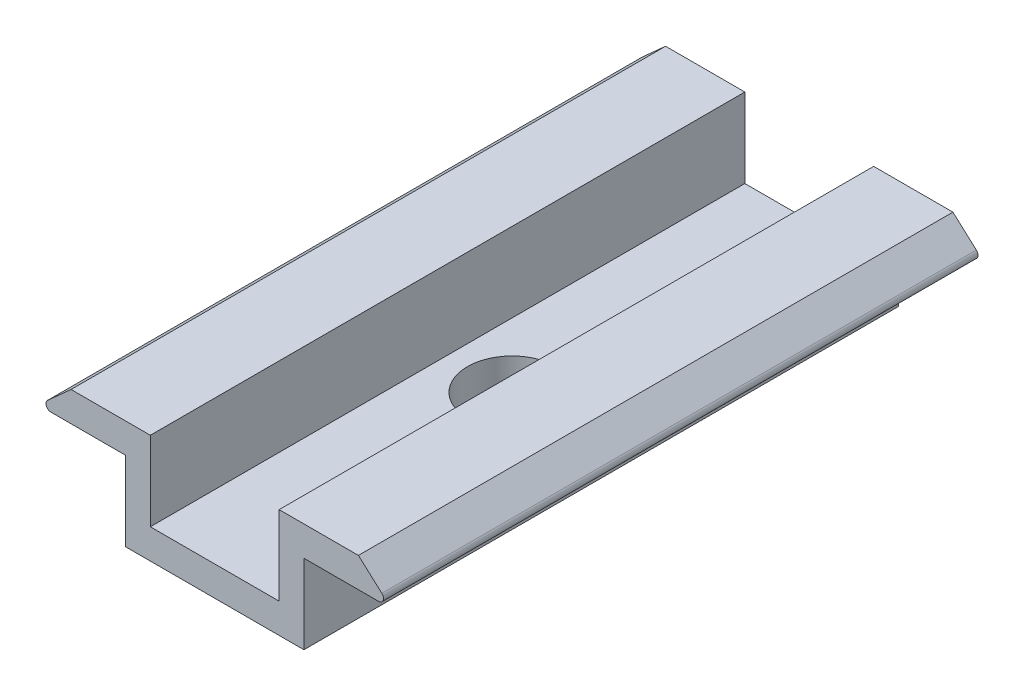
ISO-10303-21;
HEADER;
FILE_DESCRIPTION(('STEP AP214'),'2;1');
FILE_NAME('part.step','',(''),(''),'','','');
FILE_SCHEMA(('AUTOMOTIVE_DESIGN { 1 0 10303 214 1 1 1 1 }'));
ENDSEC;
DATA;
#1=APPLICATION_CONTEXT('core data for automotive mechanical design processes');
#2=APPLICATION_PROTOCOL_DEFINITION('international standard','automotive_design',2000,#1);
#3=PRODUCT_CONTEXT('',#1,'mechanical');
#4=PRODUCT('Part','Part','',(#3));
#5=PRODUCT_RELATED_PRODUCT_CATEGORY('part','',(#4));
#6=PRODUCT_DEFINITION_FORMATION('','',#4);
#7=PRODUCT_DEFINITION_CONTEXT('part definition',#1,'design');
#8=PRODUCT_DEFINITION('design','',#6,#7);
#9=PRODUCT_DEFINITION_SHAPE('','',#8);
#10=(LENGTH_UNIT() NAMED_UNIT(*) SI_UNIT(.MILLI.,.METRE.));
#11=(NAMED_UNIT(*) PLANE_ANGLE_UNIT() SI_UNIT($,.RADIAN.));
#12=(NAMED_UNIT(*) SI_UNIT($,.STERADIAN.) SOLID_ANGLE_UNIT());
#13=UNCERTAINTY_MEASURE_WITH_UNIT(LENGTH_MEASURE(1.E-05),#10,'distance_accuracy_value','');
#14=(GEOMETRIC_REPRESENTATION_CONTEXT(3) GLOBAL_UNCERTAINTY_ASSIGNED_CONTEXT((#13)) GLOBAL_UNIT_ASSIGNED_CONTEXT((#10,
#11,#12)) REPRESENTATION_CONTEXT('',''));
#15=CARTESIAN_POINT('',(0.,0.,0.));
#16=DIRECTION('',(0.,0.,1.));
#17=DIRECTION('',(1.,0.,0.));
#18=AXIS2_PLACEMENT_3D('',#15,#16,#17);
#19=CARTESIAN_POINT('',(-2.84987124557954,6.73877227141326,60.));
#20=DIRECTION('',(0.,0.,-1.));
#21=DIRECTION('',(-1.,0.,0.));
#22=AXIS2_PLACEMENT_3D('',#19,#20,#21);
#23=CYLINDRICAL_SURFACE('',#22,0.5);
#24=DIRECTION('',(0.,0.,1.));
#25=VECTOR('',#24,1.);
#26=CARTESIAN_POINT('',(-3.18443654875897,7.11034468415196,60.));
#27=LINE('',#26,#25);
#28=CARTESIAN_POINT('',(-3.18443654875897,7.11034468415196,60.));
#29=VERTEX_POINT('',#28);
#30=CARTESIAN_POINT('',(-3.18443654875897,7.11034468415196,0.));
#31=VERTEX_POINT('',#30);
#32=EDGE_CURVE('E119',#29,#31,#27,.F.);
#33=ORIENTED_EDGE('',*,*,#32,.T.);
#34=CARTESIAN_POINT('',(-2.84987124557954,6.73877227141326,0.));
#35=DIRECTION('',(0.,0.,-1.));
#36=DIRECTION('',(-1.,0.,0.));
#37=AXIS2_PLACEMENT_3D('',#34,#35,#36);
#38=CIRCLE('',#37,0.5);
#39=CARTESIAN_POINT('',(-2.84987124557954,6.23877227141326,0.));
#40=VERTEX_POINT('',#39);
#41=EDGE_CURVE('E114',#31,#40,#38,.F.);
#42=ORIENTED_EDGE('',*,*,#41,.T.);
#43=DIRECTION('',(0.,0.,1.));
#44=VECTOR('',#43,1.);
#45=CARTESIAN_POINT('',(-2.84987124557954,6.23877227141326,60.));
#46=LINE('',#45,#44);
#47=CARTESIAN_POINT('',(-2.84987124557954,6.23877227141326,60.));
#48=VERTEX_POINT('',#47);
#49=EDGE_CURVE('E116',#40,#48,#46,.T.);
#50=ORIENTED_EDGE('',*,*,#49,.T.);
#51=CARTESIAN_POINT('',(-2.84987124557954,6.73877227141326,60.));
#52=DIRECTION('',(0.,0.,-1.));
#53=DIRECTION('',(-1.,0.,0.));
#54=AXIS2_PLACEMENT_3D('',#51,#52,#53);
#55=CIRCLE('',#54,0.5);
#56=EDGE_CURVE('E19',#48,#29,#55,.T.);
#57=ORIENTED_EDGE('',*,*,#56,.T.);
#58=EDGE_LOOP('',(#33,#42,#50,#57));
#59=FACE_BOUND('',#58,.T.);
#60=ADVANCED_FACE('F16',(#59),#23,.T.);
#61=CARTESIAN_POINT('',(30.2087147787018,6.73877227141327,60.));
#62=DIRECTION('',(0.,0.,-1.));
#63=DIRECTION('',(-1.,0.,0.));
#64=AXIS2_PLACEMENT_3D('',#61,#62,#63);
#65=CYLINDRICAL_SURFACE('',#64,0.5);
#66=CARTESIAN_POINT('',(30.2087147787018,6.73877227141327,0.));
#67=DIRECTION('',(0.,0.,-1.));
#68=DIRECTION('',(-1.,0.,0.));
#69=AXIS2_PLACEMENT_3D('',#66,#67,#68);
#70=CIRCLE('',#69,0.5);
#71=CARTESIAN_POINT('',(30.2087147787018,6.23877227141326,0.));
#72=VERTEX_POINT('',#71);
#73=CARTESIAN_POINT('',(30.5432800818812,7.11034468415197,0.));
#74=VERTEX_POINT('',#73);
#75=EDGE_CURVE('E131',#72,#74,#70,.F.);
#76=ORIENTED_EDGE('',*,*,#75,.T.);
#77=DIRECTION('',(0.,0.,1.));
#78=VECTOR('',#77,1.);
#79=CARTESIAN_POINT('',(30.5432800818812,7.11034468415196,60.));
#80=LINE('',#79,#78);
#81=CARTESIAN_POINT('',(30.5432800818812,7.11034468415197,60.));
#82=VERTEX_POINT('',#81);
#83=EDGE_CURVE('E182',#74,#82,#80,.T.);
#84=ORIENTED_EDGE('',*,*,#83,.T.);
#85=CARTESIAN_POINT('',(30.2087147787018,6.73877227141327,60.));
#86=DIRECTION('',(0.,0.,-1.));
#87=DIRECTION('',(-1.,0.,0.));
#88=AXIS2_PLACEMENT_3D('',#85,#86,#87);
#89=CIRCLE('',#88,0.5);
#90=CARTESIAN_POINT('',(30.2087147787018,6.23877227141326,60.));
#91=VERTEX_POINT('',#90);
#92=EDGE_CURVE('E123',#82,#91,#89,.T.);
#93=ORIENTED_EDGE('',*,*,#92,.T.);
#94=DIRECTION('',(0.,0.,1.));
#95=VECTOR('',#94,1.);
#96=CARTESIAN_POINT('',(30.2087147787018,6.23877227141326,60.));
#97=LINE('',#96,#95);
#98=EDGE_CURVE('E178',#91,#72,#97,.F.);
#99=ORIENTED_EDGE('',*,*,#98,.T.);
#100=EDGE_LOOP('',(#76,#84,#93,#99));
#101=FACE_BOUND('',#100,.T.);
#102=ADVANCED_FACE('F335',(#101),#65,.T.);
#103=CARTESIAN_POINT('',(4.67942176656113,6.23877227141326,60.));
#104=DIRECTION('',(0.,1.,0.));
#105=DIRECTION('',(-1.,0.,0.));
#106=AXIS2_PLACEMENT_3D('',#103,#104,#105);
#107=PLANE('',#106);
#108=ORIENTED_EDGE('',*,*,#49,.F.);
#109=DIRECTION('',(-1.,0.,0.));
#110=VECTOR('',#109,1.);
#111=CARTESIAN_POINT('',(0.,6.23877227141326,0.));
#112=LINE('',#111,#110);
#113=CARTESIAN_POINT('',(4.67942176656113,6.23877227141326,0.));
#114=VERTEX_POINT('',#113);
#115=EDGE_CURVE('E127',#114,#40,#112,.T.);
#116=ORIENTED_EDGE('',*,*,#115,.F.);
#117=DIRECTION('',(0.,0.,1.));
#118=VECTOR('',#117,1.);
#119=CARTESIAN_POINT('',(4.67942176656113,6.23877227141326,60.));
#120=LINE('',#119,#118);
#121=CARTESIAN_POINT('',(4.67942176656113,6.23877227141326,60.));
#122=VERTEX_POINT('',#121);
#123=EDGE_CURVE('E262',#114,#122,#120,.T.);
#124=ORIENTED_EDGE('',*,*,#123,.T.);
#125=DIRECTION('',(-1.,0.,0.));
#126=VECTOR('',#125,1.);
#127=CARTESIAN_POINT('',(0.,6.23877227141326,60.));
#128=LINE('',#127,#126);
#129=EDGE_CURVE('E129',#122,#48,#128,.T.);
#130=ORIENTED_EDGE('',*,*,#129,.T.);
#131=EDGE_LOOP('',(#108,#116,#124,#130));
#132=FACE_BOUND('',#131,.T.);
#133=ADVANCED_FACE('F126',(#132),#107,.F.);
#134=CARTESIAN_POINT('',(-4.15241577792644,6.23877227141326,60.));
#135=DIRECTION('',(0.66913060635886,-0.743144825477393,0.));
#136=DIRECTION('',(0.743144825477393,0.66913060635886,0.));
#137=AXIS2_PLACEMENT_3D('',#134,#135,#136);
#138=PLANE('',#137);
#139=ORIENTED_EDGE('',*,*,#32,.F.);
#140=DIRECTION('',(0.743144825477393,0.669130606358859,0.));
#141=VECTOR('',#140,1.);
#142=CARTESIAN_POINT('',(-3.18443654875897,7.11034468415196,60.));
#143=LINE('',#142,#141);
#144=CARTESIAN_POINT('',(-0.820578233438874,9.23877227141326,60.));
#145=VERTEX_POINT('',#144);
#146=EDGE_CURVE('E155',#29,#145,#143,.T.);
#147=ORIENTED_EDGE('',*,*,#146,.T.);
#148=DIRECTION('',(0.,0.,-1.));
#149=VECTOR('',#148,1.);
#150=CARTESIAN_POINT('',(-0.820578233438874,9.23877227141326,60.));
#151=LINE('',#150,#149);
#152=CARTESIAN_POINT('',(-0.820578233438874,9.23877227141326,0.));
#153=VERTEX_POINT('',#152);
#154=EDGE_CURVE('E243',#145,#153,#151,.T.);
#155=ORIENTED_EDGE('',*,*,#154,.T.);
#156=DIRECTION('',(0.743144825477393,0.669130606358859,0.));
#157=VECTOR('',#156,1.);
#158=CARTESIAN_POINT('',(-3.18443654875897,7.11034468415196,0.));
#159=LINE('',#158,#157);
#160=EDGE_CURVE('E138',#31,#153,#159,.T.);
#161=ORIENTED_EDGE('',*,*,#160,.F.);
#162=EDGE_LOOP('',(#139,#147,#155,#161));
#163=FACE_BOUND('',#162,.T.);
#164=ADVANCED_FACE('F363',(#163),#138,.F.);
#165=CARTESIAN_POINT('',(-0.820578233438874,9.23877227141326,60.));
#166=DIRECTION('',(0.,-1.,0.));
#167=DIRECTION('',(0.,0.,-1.));
#168=AXIS2_PLACEMENT_3D('',#165,#166,#167);
#169=PLANE('',#168);
#170=ORIENTED_EDGE('',*,*,#154,.F.);
#171=DIRECTION('',(-1.,0.,0.));
#172=VECTOR('',#171,1.);
#173=CARTESIAN_POINT('',(0.,9.23877227141326,60.));
#174=LINE('',#173,#172);
#175=CARTESIAN_POINT('',(7.17942176656113,9.23877227141326,60.));
#176=VERTEX_POINT('',#175);
#177=EDGE_CURVE('E265',#145,#176,#174,.F.);
#178=ORIENTED_EDGE('',*,*,#177,.T.);
#179=DIRECTION('',(0.,0.,1.));
#180=VECTOR('',#179,1.);
#181=CARTESIAN_POINT('',(7.17942176656113,9.23877227141326,60.));
#182=LINE('',#181,#180);
#183=CARTESIAN_POINT('',(7.17942176656113,9.23877227141326,0.));
#184=VERTEX_POINT('',#183);
#185=EDGE_CURVE('E233',#176,#184,#182,.F.);
#186=ORIENTED_EDGE('',*,*,#185,.T.);
#187=DIRECTION('',(-1.,0.,0.));
#188=VECTOR('',#187,1.);
#189=CARTESIAN_POINT('',(0.,9.23877227141326,0.));
#190=LINE('',#189,#188);
#191=EDGE_CURVE('E145',#153,#184,#190,.F.);
#192=ORIENTED_EDGE('',*,*,#191,.F.);
#193=EDGE_LOOP('',(#170,#178,#186,#192));
#194=FACE_BOUND('',#193,.T.);
#195=ADVANCED_FACE('F367',(#194),#169,.F.);
#196=CARTESIAN_POINT('',(7.17942176656113,9.23877227141326,60.));
#197=DIRECTION('',(-1.,0.,0.));
#198=DIRECTION('',(0.,-1.,0.));
#199=AXIS2_PLACEMENT_3D('',#196,#197,#198);
#200=PLANE('',#199);
#201=ORIENTED_EDGE('',*,*,#185,.F.);
#202=DIRECTION('',(0.,1.,0.));
#203=VECTOR('',#202,1.);
#204=CARTESIAN_POINT('',(7.17942176656113,0.,60.));
#205=LINE('',#204,#203);
#206=CARTESIAN_POINT('',(7.17942176656113,1.23877227141326,60.));
#207=VERTEX_POINT('',#206);
#208=EDGE_CURVE('E288',#176,#207,#205,.F.);
#209=ORIENTED_EDGE('',*,*,#208,.T.);
#210=DIRECTION('',(0.,0.,-1.));
#211=VECTOR('',#210,1.);
#212=CARTESIAN_POINT('',(7.17942176656113,1.23877227141326,60.));
#213=LINE('',#212,#211);
#214=CARTESIAN_POINT('',(7.17942176656113,1.23877227141326,0.));
#215=VERTEX_POINT('',#214);
#216=EDGE_CURVE('E222',#207,#215,#213,.T.);
#217=ORIENTED_EDGE('',*,*,#216,.T.);
#218=DIRECTION('',(0.,1.,0.));
#219=VECTOR('',#218,1.);
#220=CARTESIAN_POINT('',(7.17942176656113,0.,0.));
#221=LINE('',#220,#219);
#222=EDGE_CURVE('E227',#184,#215,#221,.F.);
#223=ORIENTED_EDGE('',*,*,#222,.F.);
#224=EDGE_LOOP('',(#201,#209,#217,#223));
#225=FACE_BOUND('',#224,.T.);
#226=ADVANCED_FACE('F370',(#225),#200,.F.);
#227=CARTESIAN_POINT('',(7.17942176656113,1.23877227141326,60.));
#228=DIRECTION('',(0.,-1.,0.));
#229=DIRECTION('',(0.,0.,-1.));
#230=AXIS2_PLACEMENT_3D('',#227,#228,#229);
#231=PLANE('',#230);
#232=ORIENTED_EDGE('',*,*,#216,.F.);
#233=DIRECTION('',(-1.,0.,0.));
#234=VECTOR('',#233,1.);
#235=CARTESIAN_POINT('',(0.,1.23877227141326,60.));
#236=LINE('',#235,#234);
#237=CARTESIAN_POINT('',(20.1794217665612,1.23877227141326,60.));
#238=VERTEX_POINT('',#237);
#239=EDGE_CURVE('E310',#207,#238,#236,.F.);
#240=ORIENTED_EDGE('',*,*,#239,.T.);
#241=DIRECTION('',(0.,0.,-1.));
#242=VECTOR('',#241,1.);
#243=CARTESIAN_POINT('',(20.1794217665612,1.23877227141326,60.));
#244=LINE('',#243,#242);
#245=CARTESIAN_POINT('',(20.1794217665612,1.23877227141326,0.));
#246=VERTEX_POINT('',#245);
#247=EDGE_CURVE('E211',#238,#246,#244,.T.);
#248=ORIENTED_EDGE('',*,*,#247,.T.);
#249=DIRECTION('',(-1.,0.,0.));
#250=VECTOR('',#249,1.);
#251=CARTESIAN_POINT('',(0.,1.23877227141326,0.));
#252=LINE('',#251,#250);
#253=EDGE_CURVE('E216',#215,#246,#252,.F.);
#254=ORIENTED_EDGE('',*,*,#253,.F.);
#255=EDGE_LOOP('',(#232,#240,#248,#254));
#256=FACE_BOUND('',#255,.T.);
#257=CARTESIAN_POINT('',(13.6794217665611,1.23877227141326,30.));
#258=DIRECTION('',(0.,1.,0.));
#259=DIRECTION('',(0.,0.,1.));
#260=AXIS2_PLACEMENT_3D('',#257,#258,#259);
#261=CIRCLE('',#260,4.5);
#262=CARTESIAN_POINT('',(13.6794217665611,1.23877227141326,34.5));
#263=VERTEX_POINT('',#262);
#264=EDGE_CURVE('E181',#263,#263,#261,.F.);
#265=ORIENTED_EDGE('',*,*,#264,.T.);
#266=EDGE_LOOP('',(#265));
#267=FACE_BOUND('',#266,.T.);
#268=ADVANCED_FACE('F374',(#256,#267),#231,.F.);
#269=CARTESIAN_POINT('',(20.1794217665612,1.23877227141326,60.));
#270=DIRECTION('',(1.,0.,0.));
#271=DIRECTION('',(0.,0.,-1.));
#272=AXIS2_PLACEMENT_3D('',#269,#270,#271);
#273=PLANE('',#272);
#274=ORIENTED_EDGE('',*,*,#247,.F.);
#275=DIRECTION('',(0.,1.,0.));
#276=VECTOR('',#275,1.);
#277=CARTESIAN_POINT('',(20.1794217665612,0.,60.));
#278=LINE('',#277,#276);
#279=CARTESIAN_POINT('',(20.1794217665612,9.23877227141326,60.));
#280=VERTEX_POINT('',#279);
#281=EDGE_CURVE('E304',#238,#280,#278,.T.);
#282=ORIENTED_EDGE('',*,*,#281,.T.);
#283=DIRECTION('',(0.,0.,-1.));
#284=VECTOR('',#283,1.);
#285=CARTESIAN_POINT('',(20.1794217665612,9.23877227141326,60.));
#286=LINE('',#285,#284);
#287=CARTESIAN_POINT('',(20.1794217665612,9.23877227141326,0.));
#288=VERTEX_POINT('',#287);
#289=EDGE_CURVE('E198',#280,#288,#286,.T.);
#290=ORIENTED_EDGE('',*,*,#289,.T.);
#291=DIRECTION('',(0.,1.,0.));
#292=VECTOR('',#291,1.);
#293=CARTESIAN_POINT('',(20.1794217665612,0.,0.));
#294=LINE('',#293,#292);
#295=EDGE_CURVE('E205',#246,#288,#294,.T.);
#296=ORIENTED_EDGE('',*,*,#295,.F.);
#297=EDGE_LOOP('',(#274,#282,#290,#296));
#298=FACE_BOUND('',#297,.T.);
#299=ADVANCED_FACE('F380',(#298),#273,.F.);
#300=CARTESIAN_POINT('',(20.1794217665612,9.23877227141326,60.));
#301=DIRECTION('',(0.,-1.,0.));
#302=DIRECTION('',(0.,0.,-1.));
#303=AXIS2_PLACEMENT_3D('',#300,#301,#302);
#304=PLANE('',#303);
#305=ORIENTED_EDGE('',*,*,#289,.F.);
#306=DIRECTION('',(-1.,0.,0.));
#307=VECTOR('',#306,1.);
#308=CARTESIAN_POINT('',(0.,9.23877227141326,60.));
#309=LINE('',#308,#307);
#310=CARTESIAN_POINT('',(28.1794217665611,9.23877227141326,60.));
#311=VERTEX_POINT('',#310);
#312=EDGE_CURVE('E175',#280,#311,#309,.F.);
#313=ORIENTED_EDGE('',*,*,#312,.T.);
#314=DIRECTION('',(0.,0.,1.));
#315=VECTOR('',#314,1.);
#316=CARTESIAN_POINT('',(28.1794217665611,9.23877227141326,60.));
#317=LINE('',#316,#315);
#318=CARTESIAN_POINT('',(28.1794217665611,9.23877227141326,0.));
#319=VERTEX_POINT('',#318);
#320=EDGE_CURVE('E194',#311,#319,#317,.F.);
#321=ORIENTED_EDGE('',*,*,#320,.T.);
#322=DIRECTION('',(-1.,0.,0.));
#323=VECTOR('',#322,1.);
#324=CARTESIAN_POINT('',(0.,9.23877227141326,0.));
#325=LINE('',#324,#323);
#326=EDGE_CURVE('E201',#288,#319,#325,.F.);
#327=ORIENTED_EDGE('',*,*,#326,.F.);
#328=EDGE_LOOP('',(#305,#313,#321,#327));
#329=FACE_BOUND('',#328,.T.);
#330=ADVANCED_FACE('F384',(#329),#304,.F.);
#331=CARTESIAN_POINT('',(28.1794217665611,9.23877227141326,60.));
#332=DIRECTION('',(-0.66913060635886,-0.743144825477393,0.));
#333=DIRECTION('',(0.743144825477393,-0.66913060635886,0.));
#334=AXIS2_PLACEMENT_3D('',#331,#332,#333);
#335=PLANE('',#334);
#336=ORIENTED_EDGE('',*,*,#83,.F.);
#337=DIRECTION('',(0.743144825477394,-0.669130606358859,0.));
#338=VECTOR('',#337,1.);
#339=CARTESIAN_POINT('',(28.1794217665611,9.23877227141326,0.));
#340=LINE('',#339,#338);
#341=EDGE_CURVE('E204',#319,#74,#340,.T.);
#342=ORIENTED_EDGE('',*,*,#341,.F.);
#343=ORIENTED_EDGE('',*,*,#320,.F.);
#344=DIRECTION('',(0.743144825477394,-0.669130606358859,0.));
#345=VECTOR('',#344,1.);
#346=CARTESIAN_POINT('',(28.1794217665611,9.23877227141326,60.));
#347=LINE('',#346,#345);
#348=EDGE_CURVE('E169',#311,#82,#347,.T.);
#349=ORIENTED_EDGE('',*,*,#348,.T.);
#350=EDGE_LOOP('',(#336,#342,#343,#349));
#351=FACE_BOUND('',#350,.T.);
#352=ADVANCED_FACE('F387',(#351),#335,.F.);
#353=CARTESIAN_POINT('',(31.5112593110487,6.23877227141326,60.));
#354=DIRECTION('',(0.,1.,0.));
#355=DIRECTION('',(-1.,0.,0.));
#356=AXIS2_PLACEMENT_3D('',#353,#354,#355);
#357=PLANE('',#356);
#358=ORIENTED_EDGE('',*,*,#98,.F.);
#359=DIRECTION('',(-1.,0.,0.));
#360=VECTOR('',#359,1.);
#361=CARTESIAN_POINT('',(0.,6.23877227141326,60.));
#362=LINE('',#361,#360);
#363=CARTESIAN_POINT('',(22.6794217665611,6.23877227141326,60.));
#364=VERTEX_POINT('',#363);
#365=EDGE_CURVE('E166',#91,#364,#362,.T.);
#366=ORIENTED_EDGE('',*,*,#365,.T.);
#367=DIRECTION('',(0.,0.,1.));
#368=VECTOR('',#367,1.);
#369=CARTESIAN_POINT('',(22.6794217665611,6.23877227141326,60.));
#370=LINE('',#369,#368);
#371=CARTESIAN_POINT('',(22.6794217665611,6.23877227141326,0.));
#372=VERTEX_POINT('',#371);
#373=EDGE_CURVE('E139',#364,#372,#370,.F.);
#374=ORIENTED_EDGE('',*,*,#373,.T.);
#375=DIRECTION('',(-1.,0.,0.));
#376=VECTOR('',#375,1.);
#377=CARTESIAN_POINT('',(0.,6.23877227141326,0.));
#378=LINE('',#377,#376);
#379=EDGE_CURVE('E188',#72,#372,#378,.T.);
#380=ORIENTED_EDGE('',*,*,#379,.F.);
#381=EDGE_LOOP('',(#358,#366,#374,#380));
#382=FACE_BOUND('',#381,.T.);
#383=ADVANCED_FACE('F342',(#382),#357,.F.);
#384=CARTESIAN_POINT('',(13.6794217665611,-1.76122772858674,30.));
#385=DIRECTION('',(0.,1.,0.));
#386=DIRECTION('',(0.,0.,1.));
#387=AXIS2_PLACEMENT_3D('',#384,#385,#386);
#388=CYLINDRICAL_SURFACE('',#387,4.5);
#389=CARTESIAN_POINT('',(13.6794217665611,-1.76122772858674,30.));
#390=DIRECTION('',(0.,1.,0.));
#391=DIRECTION('',(0.,0.,1.));
#392=AXIS2_PLACEMENT_3D('',#389,#390,#391);
#393=CIRCLE('',#392,4.5);
#394=CARTESIAN_POINT('',(13.6794217665611,-1.76122772858674,34.5));
#395=VERTEX_POINT('',#394);
#396=EDGE_CURVE('E259',#395,#395,#393,.F.);
#397=ORIENTED_EDGE('',*,*,#396,.T.);
#398=EDGE_LOOP('',(#397));
#399=FACE_BOUND('',#398,.T.);
#400=ORIENTED_EDGE('',*,*,#264,.F.);
#401=EDGE_LOOP('',(#400));
#402=FACE_BOUND('',#401,.T.);
#403=ADVANCED_FACE('F417',(#399,#402),#388,.F.);
#404=CARTESIAN_POINT('',(4.67942176656113,-1.76122772858674,60.));
#405=DIRECTION('',(1.,0.,0.));
#406=DIRECTION('',(0.,1.,0.));
#407=AXIS2_PLACEMENT_3D('',#404,#405,#406);
#408=PLANE('',#407);
#409=DIRECTION('',(0.,0.,1.));
#410=VECTOR('',#409,1.);
#411=CARTESIAN_POINT('',(4.67942176656113,-1.76122772858674,60.));
#412=LINE('',#411,#410);
#413=CARTESIAN_POINT('',(4.67942176656113,-1.76122772858674,0.));
#414=VERTEX_POINT('',#413);
#415=CARTESIAN_POINT('',(4.67942176656113,-1.76122772858674,60.));
#416=VERTEX_POINT('',#415);
#417=EDGE_CURVE('E282',#414,#416,#412,.T.);
#418=ORIENTED_EDGE('',*,*,#417,.T.);
#419=DIRECTION('',(0.,1.,0.));
#420=VECTOR('',#419,1.);
#421=CARTESIAN_POINT('',(4.67942176656113,0.,60.));
#422=LINE('',#421,#420);
#423=EDGE_CURVE('E163',#416,#122,#422,.T.);
#424=ORIENTED_EDGE('',*,*,#423,.T.);
#425=ORIENTED_EDGE('',*,*,#123,.F.);
#426=DIRECTION('',(0.,1.,0.));
#427=VECTOR('',#426,1.);
#428=CARTESIAN_POINT('',(4.67942176656113,0.,0.));
#429=LINE('',#428,#427);
#430=EDGE_CURVE('E136',#414,#114,#429,.T.);
#431=ORIENTED_EDGE('',*,*,#430,.F.);
#432=EDGE_LOOP('',(#418,#424,#425,#431));
#433=FACE_BOUND('',#432,.T.);
#434=ADVANCED_FACE('F354',(#433),#408,.F.);
#435=CARTESIAN_POINT('',(0.,0.,60.));
#436=DIRECTION('',(0.,0.,-1.));
#437=DIRECTION('',(-1.,0.,0.));
#438=AXIS2_PLACEMENT_3D('',#435,#436,#437);
#439=PLANE('',#438);
#440=ORIENTED_EDGE('',*,*,#56,.F.);
#441=ORIENTED_EDGE('',*,*,#129,.F.);
#442=ORIENTED_EDGE('',*,*,#423,.F.);
#443=DIRECTION('',(-1.,0.,0.));
#444=VECTOR('',#443,1.);
#445=CARTESIAN_POINT('',(22.6794217665611,-1.76122772858674,60.));
#446=LINE('',#445,#444);
#447=CARTESIAN_POINT('',(22.6794217665611,-1.76122772858674,60.));
#448=VERTEX_POINT('',#447);
#449=EDGE_CURVE('E276',#416,#448,#446,.F.);
#450=ORIENTED_EDGE('',*,*,#449,.T.);
#451=DIRECTION('',(0.,1.,0.));
#452=VECTOR('',#451,1.);
#453=CARTESIAN_POINT('',(22.6794217665611,6.23877227141326,60.));
#454=LINE('',#453,#452);
#455=EDGE_CURVE('E148',#448,#364,#454,.T.);
#456=ORIENTED_EDGE('',*,*,#455,.T.);
#457=ORIENTED_EDGE('',*,*,#365,.F.);
#458=ORIENTED_EDGE('',*,*,#92,.F.);
#459=ORIENTED_EDGE('',*,*,#348,.F.);
#460=ORIENTED_EDGE('',*,*,#312,.F.);
#461=ORIENTED_EDGE('',*,*,#281,.F.);
#462=ORIENTED_EDGE('',*,*,#239,.F.);
#463=ORIENTED_EDGE('',*,*,#208,.F.);
#464=ORIENTED_EDGE('',*,*,#177,.F.);
#465=ORIENTED_EDGE('',*,*,#146,.F.);
#466=EDGE_LOOP('',(#440,#441,#442,#450,#456,#457,#458,#459,#460,#461,#462,#463,#464,#465));
#467=FACE_BOUND('',#466,.T.);
#468=ADVANCED_FACE('F345',(#467),#439,.F.);
#469=CARTESIAN_POINT('',(22.6794217665611,6.23877227141326,60.));
#470=DIRECTION('',(-1.,0.,0.));
#471=DIRECTION('',(0.,0.,1.));
#472=AXIS2_PLACEMENT_3D('',#469,#470,#471);
#473=PLANE('',#472);
#474=ORIENTED_EDGE('',*,*,#373,.F.);
#475=ORIENTED_EDGE('',*,*,#455,.F.);
#476=DIRECTION('',(0.,0.,1.));
#477=VECTOR('',#476,1.);
#478=CARTESIAN_POINT('',(22.6794217665611,-1.76122772858674,60.));
#479=LINE('',#478,#477);
#480=CARTESIAN_POINT('',(22.6794217665611,-1.76122772858674,0.));
#481=VERTEX_POINT('',#480);
#482=EDGE_CURVE('E26',#448,#481,#479,.F.);
#483=ORIENTED_EDGE('',*,*,#482,.T.);
#484=DIRECTION('',(0.,1.,0.));
#485=VECTOR('',#484,1.);
#486=CARTESIAN_POINT('',(22.6794217665611,0.,0.));
#487=LINE('',#486,#485);
#488=EDGE_CURVE('E34',#372,#481,#487,.F.);
#489=ORIENTED_EDGE('',*,*,#488,.F.);
#490=EDGE_LOOP('',(#474,#475,#483,#489));
#491=FACE_BOUND('',#490,.T.);
#492=ADVANCED_FACE('F349',(#491),#473,.F.);
#493=CARTESIAN_POINT('',(0.,0.,0.));
#494=DIRECTION('',(0.,0.,-1.));
#495=DIRECTION('',(-1.,0.,0.));
#496=AXIS2_PLACEMENT_3D('',#493,#494,#495);
#497=PLANE('',#496);
#498=DIRECTION('',(-1.,0.,0.));
#499=VECTOR('',#498,1.);
#500=CARTESIAN_POINT('',(22.6794217665611,-1.76122772858674,0.));
#501=LINE('',#500,#499);
#502=EDGE_CURVE('E11',#481,#414,#501,.T.);
#503=ORIENTED_EDGE('',*,*,#502,.T.);
#504=ORIENTED_EDGE('',*,*,#430,.T.);
#505=ORIENTED_EDGE('',*,*,#115,.T.);
#506=ORIENTED_EDGE('',*,*,#41,.F.);
#507=ORIENTED_EDGE('',*,*,#160,.T.);
#508=ORIENTED_EDGE('',*,*,#191,.T.);
#509=ORIENTED_EDGE('',*,*,#222,.T.);
#510=ORIENTED_EDGE('',*,*,#253,.T.);
#511=ORIENTED_EDGE('',*,*,#295,.T.);
#512=ORIENTED_EDGE('',*,*,#326,.T.);
#513=ORIENTED_EDGE('',*,*,#341,.T.);
#514=ORIENTED_EDGE('',*,*,#75,.F.);
#515=ORIENTED_EDGE('',*,*,#379,.T.);
#516=ORIENTED_EDGE('',*,*,#488,.T.);
#517=EDGE_LOOP('',(#503,#504,#505,#506,#507,#508,#509,#510,#511,#512,#513,#514,#515,#516));
#518=FACE_BOUND('',#517,.T.);
#519=ADVANCED_FACE('F134',(#518),#497,.T.);
#520=CARTESIAN_POINT('',(22.6794217665611,-1.76122772858674,60.));
#521=DIRECTION('',(0.,1.,0.));
#522=DIRECTION('',(-1.,0.,0.));
#523=AXIS2_PLACEMENT_3D('',#520,#521,#522);
#524=PLANE('',#523);
#525=ORIENTED_EDGE('',*,*,#482,.F.);
#526=ORIENTED_EDGE('',*,*,#449,.F.);
#527=ORIENTED_EDGE('',*,*,#417,.F.);
#528=ORIENTED_EDGE('',*,*,#502,.F.);
#529=EDGE_LOOP('',(#525,#526,#527,#528));
#530=FACE_BOUND('',#529,.T.);
#531=ORIENTED_EDGE('',*,*,#396,.F.);
#532=EDGE_LOOP('',(#531));
#533=FACE_BOUND('',#532,.T.);
#534=ADVANCED_FACE('F351',(#530,#533),#524,.F.);
#535=CLOSED_SHELL('',(#60,#102,#133,#164,#195,#226,#268,#299,#330,#352,#383,#403,#434,#468,#492,
#519,#534));
#536=MANIFOLD_SOLID_BREP('B1',#535);
#537=ADVANCED_BREP_SHAPE_REPRESENTATION('',(#18,#536),#14);
#538=SHAPE_DEFINITION_REPRESENTATION(#9,#537);
ENDSEC;
END-ISO-10303-21;
